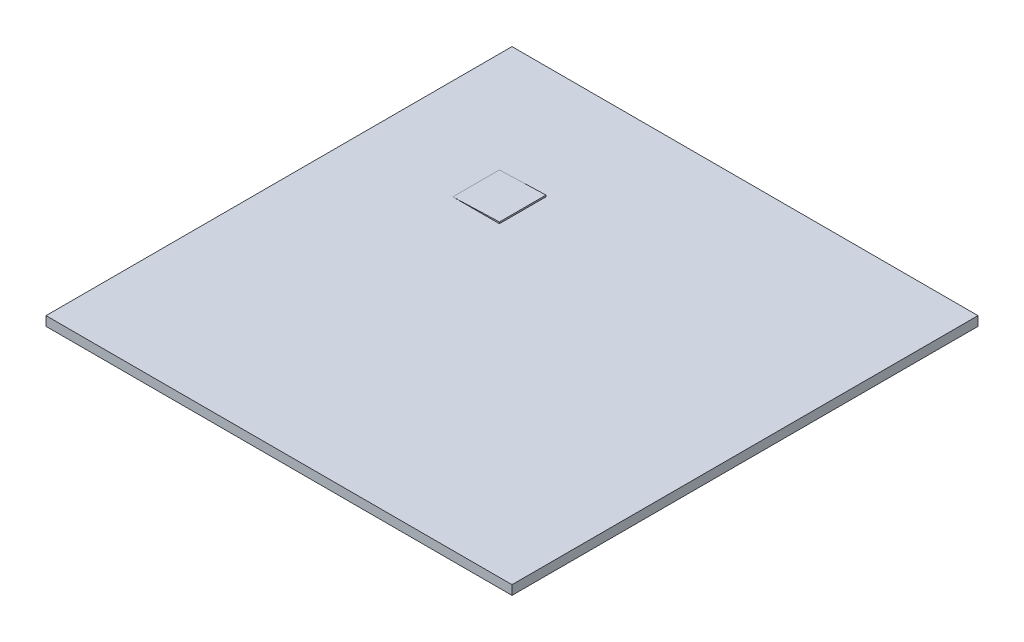
ISO-10303-21;
HEADER;
FILE_DESCRIPTION(('STEP AP214'),'2;1');
FILE_NAME('part.step','',(''),(''),'','','');
FILE_SCHEMA(('AUTOMOTIVE_DESIGN { 1 0 10303 214 1 1 1 1 }'));
ENDSEC;
DATA;
#1=APPLICATION_CONTEXT('core data for automotive mechanical design processes');
#2=APPLICATION_PROTOCOL_DEFINITION('international standard','automotive_design',2000,#1);
#3=PRODUCT_CONTEXT('',#1,'mechanical');
#4=PRODUCT('Part','Part','',(#3));
#5=PRODUCT_RELATED_PRODUCT_CATEGORY('part','',(#4));
#6=PRODUCT_DEFINITION_FORMATION('','',#4);
#7=PRODUCT_DEFINITION_CONTEXT('part definition',#1,'design');
#8=PRODUCT_DEFINITION('design','',#6,#7);
#9=PRODUCT_DEFINITION_SHAPE('','',#8);
#10=(LENGTH_UNIT() NAMED_UNIT(*) SI_UNIT(.MILLI.,.METRE.));
#11=(NAMED_UNIT(*) PLANE_ANGLE_UNIT() SI_UNIT($,.RADIAN.));
#12=(NAMED_UNIT(*) SI_UNIT($,.STERADIAN.) SOLID_ANGLE_UNIT());
#13=UNCERTAINTY_MEASURE_WITH_UNIT(LENGTH_MEASURE(1.E-05),#10,'distance_accuracy_value','');
#14=(GEOMETRIC_REPRESENTATION_CONTEXT(3) GLOBAL_UNCERTAINTY_ASSIGNED_CONTEXT((#13)) GLOBAL_UNIT_ASSIGNED_CONTEXT((#10,
#11,#12)) REPRESENTATION_CONTEXT('',''));
#15=CARTESIAN_POINT('',(0.,0.,0.));
#16=DIRECTION('',(0.,0.,1.));
#17=DIRECTION('',(1.,0.,0.));
#18=AXIS2_PLACEMENT_3D('',#15,#16,#17);
#19=CARTESIAN_POINT('',(0.,100.,0.));
#20=DIRECTION('',(0.,-1.,0.));
#21=DIRECTION('',(0.,0.,-1.));
#22=AXIS2_PLACEMENT_3D('',#19,#20,#21);
#23=PLANE('',#22);
#24=DIRECTION('',(0.,0.,-1.));
#25=VECTOR('',#24,1.);
#26=CARTESIAN_POINT('',(2500.,100.,2499.99999999999));
#27=LINE('',#26,#25);
#28=CARTESIAN_POINT('',(2500.,100.,2499.99999999999));
#29=VERTEX_POINT('',#28);
#30=CARTESIAN_POINT('',(2500.,100.,-2500.00000000001));
#31=VERTEX_POINT('',#30);
#32=EDGE_CURVE('E114',#29,#31,#27,.T.);
#33=ORIENTED_EDGE('',*,*,#32,.T.);
#34=DIRECTION('',(-1.,0.,0.));
#35=VECTOR('',#34,1.);
#36=CARTESIAN_POINT('',(-2500.,100.,-2500.00000000001));
#37=LINE('',#36,#35);
#38=CARTESIAN_POINT('',(-2500.,100.,-2500.00000000001));
#39=VERTEX_POINT('',#38);
#40=EDGE_CURVE('E117',#31,#39,#37,.T.);
#41=ORIENTED_EDGE('',*,*,#40,.T.);
#42=DIRECTION('',(0.,0.,1.));
#43=VECTOR('',#42,1.);
#44=CARTESIAN_POINT('',(-2500.,100.,2499.99999999999));
#45=LINE('',#44,#43);
#46=CARTESIAN_POINT('',(-2500.,100.,2499.99999999999));
#47=VERTEX_POINT('',#46);
#48=EDGE_CURVE('E120',#39,#47,#45,.T.);
#49=ORIENTED_EDGE('',*,*,#48,.T.);
#50=DIRECTION('',(1.,0.,0.));
#51=VECTOR('',#50,1.);
#52=CARTESIAN_POINT('',(-2500.,100.,2499.99999999999));
#53=LINE('',#52,#51);
#54=EDGE_CURVE('E122',#47,#29,#53,.T.);
#55=ORIENTED_EDGE('',*,*,#54,.T.);
#56=EDGE_LOOP('',(#33,#41,#49,#55));
#57=FACE_BOUND('',#56,.T.);
#58=DIRECTION('',(0.,0.,-1.));
#59=VECTOR('',#58,1.);
#60=CARTESIAN_POINT('',(-921.407890826004,100.,-1286.38362221704));
#61=LINE('',#60,#59);
#62=CARTESIAN_POINT('',(-921.407890826003,100.,-786.383622217045));
#63=VERTEX_POINT('',#62);
#64=CARTESIAN_POINT('',(-921.407890826004,100.,-1286.38362221704));
#65=VERTEX_POINT('',#64);
#66=EDGE_CURVE('E238',#63,#65,#61,.T.);
#67=ORIENTED_EDGE('',*,*,#66,.F.);
#68=DIRECTION('',(1.,0.,0.));
#69=VECTOR('',#68,1.);
#70=CARTESIAN_POINT('',(-1421.407890826,100.,-786.383622217045));
#71=LINE('',#70,#69);
#72=CARTESIAN_POINT('',(-1421.407890826,100.,-786.383622217045));
#73=VERTEX_POINT('',#72);
#74=EDGE_CURVE('E107',#73,#63,#71,.T.);
#75=ORIENTED_EDGE('',*,*,#74,.F.);
#76=DIRECTION('',(0.,0.,1.));
#77=VECTOR('',#76,1.);
#78=CARTESIAN_POINT('',(-1421.407890826,100.,-1286.38362221704));
#79=LINE('',#78,#77);
#80=CARTESIAN_POINT('',(-1421.407890826,100.,-1286.38362221704));
#81=VERTEX_POINT('',#80);
#82=EDGE_CURVE('E55',#81,#73,#79,.T.);
#83=ORIENTED_EDGE('',*,*,#82,.F.);
#84=DIRECTION('',(-1.,0.,0.));
#85=VECTOR('',#84,1.);
#86=CARTESIAN_POINT('',(-1421.407890826,100.,-1286.38362221704));
#87=LINE('',#86,#85);
#88=EDGE_CURVE('E237',#65,#81,#87,.T.);
#89=ORIENTED_EDGE('',*,*,#88,.F.);
#90=EDGE_LOOP('',(#67,#75,#83,#89));
#91=FACE_BOUND('',#90,.T.);
#92=ADVANCED_FACE('F32',(#57,#91),#23,.F.);
#93=CARTESIAN_POINT('',(2500.,100.,2499.99999999999));
#94=DIRECTION('',(-1.,0.,0.));
#95=DIRECTION('',(0.,0.,1.));
#96=AXIS2_PLACEMENT_3D('',#93,#94,#95);
#97=PLANE('',#96);
#98=DIRECTION('',(0.,0.,-1.));
#99=VECTOR('',#98,1.);
#100=CARTESIAN_POINT('',(2500.,0.,2499.99999999999));
#101=LINE('',#100,#99);
#102=CARTESIAN_POINT('',(2500.,0.,2499.99999999999));
#103=VERTEX_POINT('',#102);
#104=CARTESIAN_POINT('',(2500.,0.,-2500.00000000001));
#105=VERTEX_POINT('',#104);
#106=EDGE_CURVE('E109',#103,#105,#101,.T.);
#107=ORIENTED_EDGE('',*,*,#106,.T.);
#108=DIRECTION('',(0.,-1.,0.));
#109=VECTOR('',#108,1.);
#110=CARTESIAN_POINT('',(2500.,100.,-2500.00000000001));
#111=LINE('',#110,#109);
#112=EDGE_CURVE('E11',#31,#105,#111,.T.);
#113=ORIENTED_EDGE('',*,*,#112,.F.);
#114=ORIENTED_EDGE('',*,*,#32,.F.);
#115=DIRECTION('',(0.,-1.,0.));
#116=VECTOR('',#115,1.);
#117=CARTESIAN_POINT('',(2500.,100.,2499.99999999999));
#118=LINE('',#117,#116);
#119=EDGE_CURVE('E124',#29,#103,#118,.T.);
#120=ORIENTED_EDGE('',*,*,#119,.T.);
#121=EDGE_LOOP('',(#107,#113,#114,#120));
#122=FACE_BOUND('',#121,.T.);
#123=ADVANCED_FACE('F34',(#122),#97,.F.);
#124=CARTESIAN_POINT('',(-2500.,100.,-2500.00000000001));
#125=DIRECTION('',(0.,0.,1.));
#126=DIRECTION('',(1.,0.,0.));
#127=AXIS2_PLACEMENT_3D('',#124,#125,#126);
#128=PLANE('',#127);
#129=DIRECTION('',(-1.,0.,0.));
#130=VECTOR('',#129,1.);
#131=CARTESIAN_POINT('',(-2500.,0.,-2500.00000000001));
#132=LINE('',#131,#130);
#133=CARTESIAN_POINT('',(-2500.,0.,-2500.00000000001));
#134=VERTEX_POINT('',#133);
#135=EDGE_CURVE('E127',#105,#134,#132,.T.);
#136=ORIENTED_EDGE('',*,*,#135,.T.);
#137=DIRECTION('',(0.,-1.,0.));
#138=VECTOR('',#137,1.);
#139=CARTESIAN_POINT('',(-2500.,100.,-2500.00000000001));
#140=LINE('',#139,#138);
#141=EDGE_CURVE('E40',#39,#134,#140,.T.);
#142=ORIENTED_EDGE('',*,*,#141,.F.);
#143=ORIENTED_EDGE('',*,*,#40,.F.);
#144=ORIENTED_EDGE('',*,*,#112,.T.);
#145=EDGE_LOOP('',(#136,#142,#143,#144));
#146=FACE_BOUND('',#145,.T.);
#147=ADVANCED_FACE('F157',(#146),#128,.F.);
#148=CARTESIAN_POINT('',(-2500.,100.,2499.99999999999));
#149=DIRECTION('',(1.,0.,0.));
#150=DIRECTION('',(0.,0.,-1.));
#151=AXIS2_PLACEMENT_3D('',#148,#149,#150);
#152=PLANE('',#151);
#153=DIRECTION('',(0.,0.,1.));
#154=VECTOR('',#153,1.);
#155=CARTESIAN_POINT('',(-2500.,0.,2499.99999999999));
#156=LINE('',#155,#154);
#157=CARTESIAN_POINT('',(-2500.,0.,2499.99999999999));
#158=VERTEX_POINT('',#157);
#159=EDGE_CURVE('E129',#134,#158,#156,.T.);
#160=ORIENTED_EDGE('',*,*,#159,.T.);
#161=DIRECTION('',(0.,-1.,0.));
#162=VECTOR('',#161,1.);
#163=CARTESIAN_POINT('',(-2500.,100.,2499.99999999999));
#164=LINE('',#163,#162);
#165=EDGE_CURVE('E134',#47,#158,#164,.T.);
#166=ORIENTED_EDGE('',*,*,#165,.F.);
#167=ORIENTED_EDGE('',*,*,#48,.F.);
#168=ORIENTED_EDGE('',*,*,#141,.T.);
#169=EDGE_LOOP('',(#160,#166,#167,#168));
#170=FACE_BOUND('',#169,.T.);
#171=ADVANCED_FACE('F141',(#170),#152,.F.);
#172=CARTESIAN_POINT('',(-2500.,100.,2499.99999999999));
#173=DIRECTION('',(0.,0.,-1.));
#174=DIRECTION('',(-1.,0.,0.));
#175=AXIS2_PLACEMENT_3D('',#172,#173,#174);
#176=PLANE('',#175);
#177=DIRECTION('',(1.,0.,0.));
#178=VECTOR('',#177,1.);
#179=CARTESIAN_POINT('',(-2500.,0.,2499.99999999999));
#180=LINE('',#179,#178);
#181=EDGE_CURVE('E118',#158,#103,#180,.T.);
#182=ORIENTED_EDGE('',*,*,#181,.T.);
#183=ORIENTED_EDGE('',*,*,#119,.F.);
#184=ORIENTED_EDGE('',*,*,#54,.F.);
#185=ORIENTED_EDGE('',*,*,#165,.T.);
#186=EDGE_LOOP('',(#182,#183,#184,#185));
#187=FACE_BOUND('',#186,.T.);
#188=ADVANCED_FACE('F150',(#187),#176,.F.);
#189=CARTESIAN_POINT('',(0.,0.,0.));
#190=DIRECTION('',(0.,-1.,0.));
#191=DIRECTION('',(0.,0.,-1.));
#192=AXIS2_PLACEMENT_3D('',#189,#190,#191);
#193=PLANE('',#192);
#194=ORIENTED_EDGE('',*,*,#106,.F.);
#195=ORIENTED_EDGE('',*,*,#181,.F.);
#196=ORIENTED_EDGE('',*,*,#159,.F.);
#197=ORIENTED_EDGE('',*,*,#135,.F.);
#198=EDGE_LOOP('',(#194,#195,#196,#197));
#199=FACE_BOUND('',#198,.T.);
#200=ADVANCED_FACE('F147',(#199),#193,.T.);
#201=CARTESIAN_POINT('',(-921.407890826004,150.,-1286.38362221704));
#202=DIRECTION('',(-1.,0.,0.));
#203=DIRECTION('',(0.,0.,1.));
#204=AXIS2_PLACEMENT_3D('',#201,#202,#203);
#205=PLANE('',#204);
#206=DIRECTION('',(0.,-1.,0.));
#207=VECTOR('',#206,1.);
#208=CARTESIAN_POINT('',(-921.407890826004,150.,-1286.38362221704));
#209=LINE('',#208,#207);
#210=CARTESIAN_POINT('',(-921.407890826003,116.27260769086,-1286.38362221704));
#211=VERTEX_POINT('',#210);
#212=EDGE_CURVE('E47',#211,#65,#209,.T.);
#213=ORIENTED_EDGE('',*,*,#212,.F.);
#214=DIRECTION('',(0.,0.,1.));
#215=VECTOR('',#214,1.);
#216=CARTESIAN_POINT('',(-921.407890826003,116.27260769086,-1788.87740327309));
#217=LINE('',#216,#215);
#218=CARTESIAN_POINT('',(-921.407890826003,116.27260769086,-786.383622217045));
#219=VERTEX_POINT('',#218);
#220=EDGE_CURVE('E93',#211,#219,#217,.T.);
#221=ORIENTED_EDGE('',*,*,#220,.T.);
#222=DIRECTION('',(0.,-1.,0.));
#223=VECTOR('',#222,1.);
#224=CARTESIAN_POINT('',(-921.407890826003,150.,-786.383622217045));
#225=LINE('',#224,#223);
#226=EDGE_CURVE('E102',#219,#63,#225,.T.);
#227=ORIENTED_EDGE('',*,*,#226,.T.);
#228=ORIENTED_EDGE('',*,*,#66,.T.);
#229=EDGE_LOOP('',(#213,#221,#227,#228));
#230=FACE_BOUND('',#229,.T.);
#231=ADVANCED_FACE('F100',(#230),#205,.F.);
#232=CARTESIAN_POINT('',(-1421.407890826,150.,-1286.38362221704));
#233=DIRECTION('',(0.,0.,1.));
#234=DIRECTION('',(1.,0.,0.));
#235=AXIS2_PLACEMENT_3D('',#232,#233,#234);
#236=PLANE('',#235);
#237=ORIENTED_EDGE('',*,*,#88,.T.);
#238=DIRECTION('',(-0.999470824814007,-0.0325279932613168,0.));
#239=VECTOR('',#238,1.);
#240=CARTESIAN_POINT('',(-1421.407890826,100.,-1286.38362221704));
#241=LINE('',#240,#239);
#242=EDGE_CURVE('E104',#211,#81,#241,.T.);
#243=ORIENTED_EDGE('',*,*,#242,.F.);
#244=ORIENTED_EDGE('',*,*,#212,.T.);
#245=EDGE_LOOP('',(#237,#243,#244));
#246=FACE_BOUND('',#245,.T.);
#247=ADVANCED_FACE('F188',(#246),#236,.F.);
#248=CARTESIAN_POINT('',(-1421.407890826,150.,-786.383622217045));
#249=DIRECTION('',(0.,0.,-1.));
#250=DIRECTION('',(-1.,0.,0.));
#251=AXIS2_PLACEMENT_3D('',#248,#249,#250);
#252=PLANE('',#251);
#253=ORIENTED_EDGE('',*,*,#226,.F.);
#254=DIRECTION('',(0.999470824814007,0.0325279932613168,0.));
#255=VECTOR('',#254,1.);
#256=CARTESIAN_POINT('',(-1421.407890826,100.,-786.383622217045));
#257=LINE('',#256,#255);
#258=EDGE_CURVE('E90',#73,#219,#257,.T.);
#259=ORIENTED_EDGE('',*,*,#258,.F.);
#260=ORIENTED_EDGE('',*,*,#74,.T.);
#261=EDGE_LOOP('',(#253,#259,#260));
#262=FACE_BOUND('',#261,.T.);
#263=ADVANCED_FACE('F106',(#262),#252,.F.);
#264=CARTESIAN_POINT('',(-1421.407890826,100.,-1788.87740327309));
#265=DIRECTION('',(0.0325279932613168,-0.999470824814007,0.));
#266=DIRECTION('',(0.999470824814007,0.0325279932613168,0.));
#267=AXIS2_PLACEMENT_3D('',#264,#265,#266);
#268=PLANE('',#267);
#269=ORIENTED_EDGE('',*,*,#242,.T.);
#270=ORIENTED_EDGE('',*,*,#82,.T.);
#271=ORIENTED_EDGE('',*,*,#258,.T.);
#272=ORIENTED_EDGE('',*,*,#220,.F.);
#273=EDGE_LOOP('',(#269,#270,#271,#272));
#274=FACE_BOUND('',#273,.T.);
#275=ADVANCED_FACE('F92',(#274),#268,.F.);
#276=CLOSED_SHELL('',(#92,#123,#147,#171,#188,#200,#231,#247,#263,#275));
#277=MANIFOLD_SOLID_BREP('B2',#276);
#278=ADVANCED_BREP_SHAPE_REPRESENTATION('',(#18,#277),#14);
#279=SHAPE_DEFINITION_REPRESENTATION(#9,#278);
ENDSEC;
END-ISO-10303-21;
